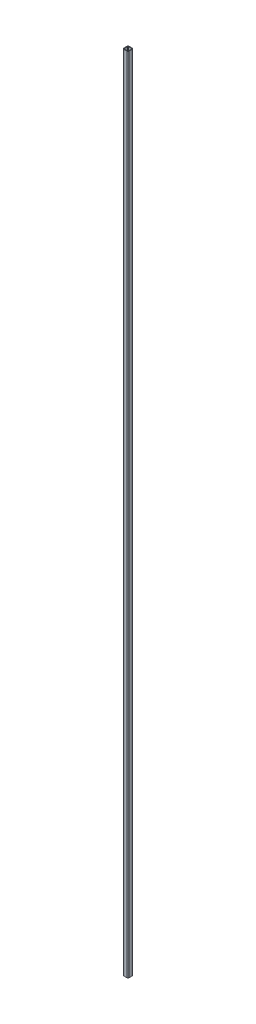
ISO-10303-21;
HEADER;
FILE_DESCRIPTION(('STEP AP214'),'2;1');
FILE_NAME('part.step','',(''),(''),'','','');
FILE_SCHEMA(('AUTOMOTIVE_DESIGN { 1 0 10303 214 1 1 1 1 }'));
ENDSEC;
DATA;
#1=APPLICATION_CONTEXT('core data for automotive mechanical design processes');
#2=APPLICATION_PROTOCOL_DEFINITION('international standard','automotive_design',2000,#1);
#3=PRODUCT_CONTEXT('',#1,'mechanical');
#4=PRODUCT('Part','Part','',(#3));
#5=PRODUCT_RELATED_PRODUCT_CATEGORY('part','',(#4));
#6=PRODUCT_DEFINITION_FORMATION('','',#4);
#7=PRODUCT_DEFINITION_CONTEXT('part definition',#1,'design');
#8=PRODUCT_DEFINITION('design','',#6,#7);
#9=PRODUCT_DEFINITION_SHAPE('','',#8);
#10=(LENGTH_UNIT() NAMED_UNIT(*) SI_UNIT(.MILLI.,.METRE.));
#11=(NAMED_UNIT(*) PLANE_ANGLE_UNIT() SI_UNIT($,.RADIAN.));
#12=(NAMED_UNIT(*) SI_UNIT($,.STERADIAN.) SOLID_ANGLE_UNIT());
#13=UNCERTAINTY_MEASURE_WITH_UNIT(LENGTH_MEASURE(1.E-05),#10,'distance_accuracy_value','');
#14=(GEOMETRIC_REPRESENTATION_CONTEXT(3) GLOBAL_UNCERTAINTY_ASSIGNED_CONTEXT((#13)) GLOBAL_UNIT_ASSIGNED_CONTEXT((#10,
#11,#12)) REPRESENTATION_CONTEXT('',''));
#15=CARTESIAN_POINT('',(0.,0.,0.));
#16=DIRECTION('',(0.,0.,1.));
#17=DIRECTION('',(1.,0.,0.));
#18=AXIS2_PLACEMENT_3D('',#15,#16,#17);
#19=CARTESIAN_POINT('',(-6.,3048.,6.));
#20=DIRECTION('',(0.,-1.,0.));
#21=DIRECTION('',(0.,0.,-1.));
#22=AXIS2_PLACEMENT_3D('',#19,#20,#21);
#23=CYLINDRICAL_SURFACE('',#22,4.);
#24=CARTESIAN_POINT('',(-6.,0.,6.));
#25=DIRECTION('',(0.,1.,0.));
#26=DIRECTION('',(0.,0.,1.));
#27=AXIS2_PLACEMENT_3D('',#24,#25,#26);
#28=CIRCLE('',#27,4.);
#29=CARTESIAN_POINT('',(-10.,0.,6.));
#30=VERTEX_POINT('',#29);
#31=CARTESIAN_POINT('',(-6.,0.,10.));
#32=VERTEX_POINT('',#31);
#33=EDGE_CURVE('E214',#30,#32,#28,.T.);
#34=ORIENTED_EDGE('',*,*,#33,.T.);
#35=DIRECTION('',(0.,-1.,0.));
#36=VECTOR('',#35,1.);
#37=CARTESIAN_POINT('',(-6.,3048.,10.));
#38=LINE('',#37,#36);
#39=CARTESIAN_POINT('',(-6.,3048.,10.));
#40=VERTEX_POINT('',#39);
#41=EDGE_CURVE('E11',#40,#32,#38,.T.);
#42=ORIENTED_EDGE('',*,*,#41,.F.);
#43=CARTESIAN_POINT('',(-6.,3048.,6.));
#44=DIRECTION('',(0.,1.,0.));
#45=DIRECTION('',(0.,0.,1.));
#46=AXIS2_PLACEMENT_3D('',#43,#44,#45);
#47=CIRCLE('',#46,4.);
#48=CARTESIAN_POINT('',(-10.,3048.,6.));
#49=VERTEX_POINT('',#48);
#50=EDGE_CURVE('E292',#49,#40,#47,.T.);
#51=ORIENTED_EDGE('',*,*,#50,.F.);
#52=DIRECTION('',(0.,-1.,0.));
#53=VECTOR('',#52,1.);
#54=CARTESIAN_POINT('',(-10.,3048.,6.));
#55=LINE('',#54,#53);
#56=EDGE_CURVE('E229',#49,#30,#55,.T.);
#57=ORIENTED_EDGE('',*,*,#56,.T.);
#58=EDGE_LOOP('',(#34,#42,#51,#57));
#59=FACE_BOUND('',#58,.T.);
#60=ADVANCED_FACE('F42',(#59),#23,.T.);
#61=CARTESIAN_POINT('',(-6.,3048.,10.));
#62=DIRECTION('',(0.,0.,-1.));
#63=DIRECTION('',(-1.,0.,0.));
#64=AXIS2_PLACEMENT_3D('',#61,#62,#63);
#65=PLANE('',#64);
#66=DIRECTION('',(1.,0.,0.));
#67=VECTOR('',#66,1.);
#68=CARTESIAN_POINT('',(-6.,0.,10.));
#69=LINE('',#68,#67);
#70=CARTESIAN_POINT('',(6.,0.,10.));
#71=VERTEX_POINT('',#70);
#72=EDGE_CURVE('E217',#32,#71,#69,.T.);
#73=ORIENTED_EDGE('',*,*,#72,.T.);
#74=DIRECTION('',(0.,-1.,0.));
#75=VECTOR('',#74,1.);
#76=CARTESIAN_POINT('',(6.,3048.,10.));
#77=LINE('',#76,#75);
#78=CARTESIAN_POINT('',(6.,3048.,10.));
#79=VERTEX_POINT('',#78);
#80=EDGE_CURVE('E52',#79,#71,#77,.T.);
#81=ORIENTED_EDGE('',*,*,#80,.F.);
#82=DIRECTION('',(1.,0.,0.));
#83=VECTOR('',#82,1.);
#84=CARTESIAN_POINT('',(-6.,3048.,10.));
#85=LINE('',#84,#83);
#86=EDGE_CURVE('E294',#40,#79,#85,.T.);
#87=ORIENTED_EDGE('',*,*,#86,.F.);
#88=ORIENTED_EDGE('',*,*,#41,.T.);
#89=EDGE_LOOP('',(#73,#81,#87,#88));
#90=FACE_BOUND('',#89,.T.);
#91=ADVANCED_FACE('F329',(#90),#65,.F.);
#92=CARTESIAN_POINT('',(6.,3048.,6.));
#93=DIRECTION('',(0.,-1.,0.));
#94=DIRECTION('',(0.,0.,-1.));
#95=AXIS2_PLACEMENT_3D('',#92,#93,#94);
#96=CYLINDRICAL_SURFACE('',#95,4.);
#97=CARTESIAN_POINT('',(6.,0.,6.));
#98=DIRECTION('',(0.,1.,0.));
#99=DIRECTION('',(0.,0.,1.));
#100=AXIS2_PLACEMENT_3D('',#97,#98,#99);
#101=CIRCLE('',#100,4.);
#102=CARTESIAN_POINT('',(10.,0.,6.));
#103=VERTEX_POINT('',#102);
#104=EDGE_CURVE('E219',#71,#103,#101,.T.);
#105=ORIENTED_EDGE('',*,*,#104,.T.);
#106=DIRECTION('',(0.,-1.,0.));
#107=VECTOR('',#106,1.);
#108=CARTESIAN_POINT('',(10.,3048.,6.));
#109=LINE('',#108,#107);
#110=CARTESIAN_POINT('',(10.,3048.,6.));
#111=VERTEX_POINT('',#110);
#112=EDGE_CURVE('E236',#111,#103,#109,.T.);
#113=ORIENTED_EDGE('',*,*,#112,.F.);
#114=CARTESIAN_POINT('',(6.,3048.,6.));
#115=DIRECTION('',(0.,1.,0.));
#116=DIRECTION('',(0.,0.,1.));
#117=AXIS2_PLACEMENT_3D('',#114,#115,#116);
#118=CIRCLE('',#117,4.);
#119=EDGE_CURVE('E296',#79,#111,#118,.T.);
#120=ORIENTED_EDGE('',*,*,#119,.F.);
#121=ORIENTED_EDGE('',*,*,#80,.T.);
#122=EDGE_LOOP('',(#105,#113,#120,#121));
#123=FACE_BOUND('',#122,.T.);
#124=ADVANCED_FACE('F334',(#123),#96,.T.);
#125=CARTESIAN_POINT('',(10.,3048.,-6.));
#126=DIRECTION('',(-1.,0.,0.));
#127=DIRECTION('',(0.,0.,1.));
#128=AXIS2_PLACEMENT_3D('',#125,#126,#127);
#129=PLANE('',#128);
#130=DIRECTION('',(0.,0.,-1.));
#131=VECTOR('',#130,1.);
#132=CARTESIAN_POINT('',(10.,0.,-6.));
#133=LINE('',#132,#131);
#134=CARTESIAN_POINT('',(10.,0.,-6.));
#135=VERTEX_POINT('',#134);
#136=EDGE_CURVE('E221',#103,#135,#133,.T.);
#137=ORIENTED_EDGE('',*,*,#136,.T.);
#138=DIRECTION('',(0.,-1.,0.));
#139=VECTOR('',#138,1.);
#140=CARTESIAN_POINT('',(10.,3048.,-6.));
#141=LINE('',#140,#139);
#142=CARTESIAN_POINT('',(10.,3048.,-6.));
#143=VERTEX_POINT('',#142);
#144=EDGE_CURVE('E233',#143,#135,#141,.T.);
#145=ORIENTED_EDGE('',*,*,#144,.F.);
#146=DIRECTION('',(0.,0.,-1.));
#147=VECTOR('',#146,1.);
#148=CARTESIAN_POINT('',(10.,3048.,-6.));
#149=LINE('',#148,#147);
#150=EDGE_CURVE('E298',#111,#143,#149,.T.);
#151=ORIENTED_EDGE('',*,*,#150,.F.);
#152=ORIENTED_EDGE('',*,*,#112,.T.);
#153=EDGE_LOOP('',(#137,#145,#151,#152));
#154=FACE_BOUND('',#153,.T.);
#155=ADVANCED_FACE('F304',(#154),#129,.F.);
#156=CARTESIAN_POINT('',(6.,3048.,-6.));
#157=DIRECTION('',(0.,-1.,0.));
#158=DIRECTION('',(0.,0.,-1.));
#159=AXIS2_PLACEMENT_3D('',#156,#157,#158);
#160=CYLINDRICAL_SURFACE('',#159,4.);
#161=CARTESIAN_POINT('',(6.,0.,-6.));
#162=DIRECTION('',(0.,1.,0.));
#163=DIRECTION('',(0.,0.,1.));
#164=AXIS2_PLACEMENT_3D('',#161,#162,#163);
#165=CIRCLE('',#164,4.);
#166=CARTESIAN_POINT('',(6.,0.,-10.));
#167=VERTEX_POINT('',#166);
#168=EDGE_CURVE('E223',#135,#167,#165,.T.);
#169=ORIENTED_EDGE('',*,*,#168,.T.);
#170=DIRECTION('',(0.,-1.,0.));
#171=VECTOR('',#170,1.);
#172=CARTESIAN_POINT('',(6.,3048.,-10.));
#173=LINE('',#172,#171);
#174=CARTESIAN_POINT('',(6.,3048.,-10.));
#175=VERTEX_POINT('',#174);
#176=EDGE_CURVE('E181',#175,#167,#173,.T.);
#177=ORIENTED_EDGE('',*,*,#176,.F.);
#178=CARTESIAN_POINT('',(6.,3048.,-6.));
#179=DIRECTION('',(0.,1.,0.));
#180=DIRECTION('',(0.,0.,1.));
#181=AXIS2_PLACEMENT_3D('',#178,#179,#180);
#182=CIRCLE('',#181,4.);
#183=EDGE_CURVE('E172',#143,#175,#182,.T.);
#184=ORIENTED_EDGE('',*,*,#183,.F.);
#185=ORIENTED_EDGE('',*,*,#144,.T.);
#186=EDGE_LOOP('',(#169,#177,#184,#185));
#187=FACE_BOUND('',#186,.T.);
#188=ADVANCED_FACE('F308',(#187),#160,.T.);
#189=CARTESIAN_POINT('',(6.,3048.,-10.));
#190=DIRECTION('',(0.,0.,1.));
#191=DIRECTION('',(1.,0.,0.));
#192=AXIS2_PLACEMENT_3D('',#189,#190,#191);
#193=PLANE('',#192);
#194=DIRECTION('',(-1.,0.,0.));
#195=VECTOR('',#194,1.);
#196=CARTESIAN_POINT('',(6.,0.,-10.));
#197=LINE('',#196,#195);
#198=CARTESIAN_POINT('',(-6.,0.,-10.));
#199=VERTEX_POINT('',#198);
#200=EDGE_CURVE('E180',#167,#199,#197,.T.);
#201=ORIENTED_EDGE('',*,*,#200,.T.);
#202=DIRECTION('',(0.,-1.,0.));
#203=VECTOR('',#202,1.);
#204=CARTESIAN_POINT('',(-6.,3048.,-10.));
#205=LINE('',#204,#203);
#206=CARTESIAN_POINT('',(-6.,3048.,-10.));
#207=VERTEX_POINT('',#206);
#208=EDGE_CURVE('E177',#207,#199,#205,.T.);
#209=ORIENTED_EDGE('',*,*,#208,.F.);
#210=DIRECTION('',(-1.,0.,0.));
#211=VECTOR('',#210,1.);
#212=CARTESIAN_POINT('',(6.,3048.,-10.));
#213=LINE('',#212,#211);
#214=EDGE_CURVE('E166',#175,#207,#213,.T.);
#215=ORIENTED_EDGE('',*,*,#214,.F.);
#216=ORIENTED_EDGE('',*,*,#176,.T.);
#217=EDGE_LOOP('',(#201,#209,#215,#216));
#218=FACE_BOUND('',#217,.T.);
#219=ADVANCED_FACE('F178',(#218),#193,.F.);
#220=CARTESIAN_POINT('',(-6.,3048.,-6.));
#221=DIRECTION('',(0.,-1.,0.));
#222=DIRECTION('',(0.,0.,-1.));
#223=AXIS2_PLACEMENT_3D('',#220,#221,#222);
#224=CYLINDRICAL_SURFACE('',#223,4.);
#225=CARTESIAN_POINT('',(-6.,0.,-6.));
#226=DIRECTION('',(0.,1.,0.));
#227=DIRECTION('',(0.,0.,1.));
#228=AXIS2_PLACEMENT_3D('',#225,#226,#227);
#229=CIRCLE('',#228,4.);
#230=CARTESIAN_POINT('',(-10.,0.,-6.));
#231=VERTEX_POINT('',#230);
#232=EDGE_CURVE('E114',#199,#231,#229,.T.);
#233=ORIENTED_EDGE('',*,*,#232,.T.);
#234=DIRECTION('',(0.,-1.,0.));
#235=VECTOR('',#234,1.);
#236=CARTESIAN_POINT('',(-10.,3048.,-6.));
#237=LINE('',#236,#235);
#238=CARTESIAN_POINT('',(-10.,3048.,-6.));
#239=VERTEX_POINT('',#238);
#240=EDGE_CURVE('E182',#239,#231,#237,.T.);
#241=ORIENTED_EDGE('',*,*,#240,.F.);
#242=CARTESIAN_POINT('',(-6.,3048.,-6.));
#243=DIRECTION('',(0.,1.,0.));
#244=DIRECTION('',(0.,0.,1.));
#245=AXIS2_PLACEMENT_3D('',#242,#243,#244);
#246=CIRCLE('',#245,4.);
#247=EDGE_CURVE('E170',#207,#239,#246,.T.);
#248=ORIENTED_EDGE('',*,*,#247,.F.);
#249=ORIENTED_EDGE('',*,*,#208,.T.);
#250=EDGE_LOOP('',(#233,#241,#248,#249));
#251=FACE_BOUND('',#250,.T.);
#252=ADVANCED_FACE('F184',(#251),#224,.T.);
#253=CARTESIAN_POINT('',(6.,3048.,6.));
#254=DIRECTION('',(0.,-1.,0.));
#255=DIRECTION('',(0.,0.,-1.));
#256=AXIS2_PLACEMENT_3D('',#253,#254,#255);
#257=CYLINDRICAL_SURFACE('',#256,2.);
#258=CARTESIAN_POINT('',(6.,0.,6.));
#259=DIRECTION('',(0.,1.,0.));
#260=DIRECTION('',(0.,0.,1.));
#261=AXIS2_PLACEMENT_3D('',#258,#259,#260);
#262=CIRCLE('',#261,2.);
#263=CARTESIAN_POINT('',(6.,0.,8.));
#264=VERTEX_POINT('',#263);
#265=CARTESIAN_POINT('',(8.,0.,6.));
#266=VERTEX_POINT('',#265);
#267=EDGE_CURVE('E190',#264,#266,#262,.T.);
#268=ORIENTED_EDGE('',*,*,#267,.F.);
#269=DIRECTION('',(0.,-1.,0.));
#270=VECTOR('',#269,1.);
#271=CARTESIAN_POINT('',(6.,3048.,8.));
#272=LINE('',#271,#270);
#273=CARTESIAN_POINT('',(6.,3048.,8.));
#274=VERTEX_POINT('',#273);
#275=EDGE_CURVE('E46',#274,#264,#272,.T.);
#276=ORIENTED_EDGE('',*,*,#275,.F.);
#277=CARTESIAN_POINT('',(6.,3048.,6.));
#278=DIRECTION('',(0.,1.,0.));
#279=DIRECTION('',(0.,0.,1.));
#280=AXIS2_PLACEMENT_3D('',#277,#278,#279);
#281=CIRCLE('',#280,2.);
#282=CARTESIAN_POINT('',(8.,3048.,6.));
#283=VERTEX_POINT('',#282);
#284=EDGE_CURVE('E228',#274,#283,#281,.T.);
#285=ORIENTED_EDGE('',*,*,#284,.T.);
#286=DIRECTION('',(0.,-1.,0.));
#287=VECTOR('',#286,1.);
#288=CARTESIAN_POINT('',(8.,3048.,6.));
#289=LINE('',#288,#287);
#290=EDGE_CURVE('E186',#283,#266,#289,.T.);
#291=ORIENTED_EDGE('',*,*,#290,.T.);
#292=EDGE_LOOP('',(#268,#276,#285,#291));
#293=FACE_BOUND('',#292,.T.);
#294=ADVANCED_FACE('F44',(#293),#257,.F.);
#295=CARTESIAN_POINT('',(-6.,3048.,8.));
#296=DIRECTION('',(0.,0.,-1.));
#297=DIRECTION('',(-1.,0.,0.));
#298=AXIS2_PLACEMENT_3D('',#295,#296,#297);
#299=PLANE('',#298);
#300=DIRECTION('',(1.,0.,0.));
#301=VECTOR('',#300,1.);
#302=CARTESIAN_POINT('',(-6.,0.,8.));
#303=LINE('',#302,#301);
#304=CARTESIAN_POINT('',(-6.,0.,8.));
#305=VERTEX_POINT('',#304);
#306=EDGE_CURVE('E193',#305,#264,#303,.T.);
#307=ORIENTED_EDGE('',*,*,#306,.F.);
#308=DIRECTION('',(0.,-1.,0.));
#309=VECTOR('',#308,1.);
#310=CARTESIAN_POINT('',(-6.,3048.,8.));
#311=LINE('',#310,#309);
#312=CARTESIAN_POINT('',(-6.,3048.,8.));
#313=VERTEX_POINT('',#312);
#314=EDGE_CURVE('E251',#313,#305,#311,.T.);
#315=ORIENTED_EDGE('',*,*,#314,.F.);
#316=DIRECTION('',(1.,0.,0.));
#317=VECTOR('',#316,1.);
#318=CARTESIAN_POINT('',(-6.,3048.,8.));
#319=LINE('',#318,#317);
#320=EDGE_CURVE('E260',#313,#274,#319,.T.);
#321=ORIENTED_EDGE('',*,*,#320,.T.);
#322=ORIENTED_EDGE('',*,*,#275,.T.);
#323=EDGE_LOOP('',(#307,#315,#321,#322));
#324=FACE_BOUND('',#323,.T.);
#325=ADVANCED_FACE('F258',(#324),#299,.T.);
#326=CARTESIAN_POINT('',(-6.,3048.,6.));
#327=DIRECTION('',(0.,-1.,0.));
#328=DIRECTION('',(0.,0.,-1.));
#329=AXIS2_PLACEMENT_3D('',#326,#327,#328);
#330=CYLINDRICAL_SURFACE('',#329,2.);
#331=CARTESIAN_POINT('',(-6.,0.,6.));
#332=DIRECTION('',(0.,1.,0.));
#333=DIRECTION('',(0.,0.,1.));
#334=AXIS2_PLACEMENT_3D('',#331,#332,#333);
#335=CIRCLE('',#334,2.);
#336=CARTESIAN_POINT('',(-8.,0.,6.));
#337=VERTEX_POINT('',#336);
#338=EDGE_CURVE('E196',#337,#305,#335,.T.);
#339=ORIENTED_EDGE('',*,*,#338,.F.);
#340=DIRECTION('',(0.,-1.,0.));
#341=VECTOR('',#340,1.);
#342=CARTESIAN_POINT('',(-8.,3048.,6.));
#343=LINE('',#342,#341);
#344=CARTESIAN_POINT('',(-8.,3048.,6.));
#345=VERTEX_POINT('',#344);
#346=EDGE_CURVE('E250',#345,#337,#343,.T.);
#347=ORIENTED_EDGE('',*,*,#346,.F.);
#348=CARTESIAN_POINT('',(-6.,3048.,6.));
#349=DIRECTION('',(0.,1.,0.));
#350=DIRECTION('',(0.,0.,1.));
#351=AXIS2_PLACEMENT_3D('',#348,#349,#350);
#352=CIRCLE('',#351,2.);
#353=EDGE_CURVE('E268',#345,#313,#352,.T.);
#354=ORIENTED_EDGE('',*,*,#353,.T.);
#355=ORIENTED_EDGE('',*,*,#314,.T.);
#356=EDGE_LOOP('',(#339,#347,#354,#355));
#357=FACE_BOUND('',#356,.T.);
#358=ADVANCED_FACE('F266',(#357),#330,.F.);
#359=CARTESIAN_POINT('',(-8.,3048.,6.));
#360=DIRECTION('',(1.,0.,0.));
#361=DIRECTION('',(0.,0.,-1.));
#362=AXIS2_PLACEMENT_3D('',#359,#360,#361);
#363=PLANE('',#362);
#364=DIRECTION('',(0.,0.,1.));
#365=VECTOR('',#364,1.);
#366=CARTESIAN_POINT('',(-8.,0.,6.));
#367=LINE('',#366,#365);
#368=CARTESIAN_POINT('',(-8.,0.,-6.));
#369=VERTEX_POINT('',#368);
#370=EDGE_CURVE('E199',#369,#337,#367,.T.);
#371=ORIENTED_EDGE('',*,*,#370,.F.);
#372=DIRECTION('',(0.,-1.,0.));
#373=VECTOR('',#372,1.);
#374=CARTESIAN_POINT('',(-8.,3048.,-6.));
#375=LINE('',#374,#373);
#376=CARTESIAN_POINT('',(-8.,3048.,-6.));
#377=VERTEX_POINT('',#376);
#378=EDGE_CURVE('E248',#377,#369,#375,.T.);
#379=ORIENTED_EDGE('',*,*,#378,.F.);
#380=DIRECTION('',(0.,0.,1.));
#381=VECTOR('',#380,1.);
#382=CARTESIAN_POINT('',(-8.,3048.,6.));
#383=LINE('',#382,#381);
#384=EDGE_CURVE('E274',#377,#345,#383,.T.);
#385=ORIENTED_EDGE('',*,*,#384,.T.);
#386=ORIENTED_EDGE('',*,*,#346,.T.);
#387=EDGE_LOOP('',(#371,#379,#385,#386));
#388=FACE_BOUND('',#387,.T.);
#389=ADVANCED_FACE('F277',(#388),#363,.T.);
#390=CARTESIAN_POINT('',(-6.,3048.,-6.));
#391=DIRECTION('',(0.,-1.,0.));
#392=DIRECTION('',(0.,0.,-1.));
#393=AXIS2_PLACEMENT_3D('',#390,#391,#392);
#394=CYLINDRICAL_SURFACE('',#393,2.);
#395=CARTESIAN_POINT('',(-6.,0.,-6.));
#396=DIRECTION('',(0.,1.,0.));
#397=DIRECTION('',(0.,0.,1.));
#398=AXIS2_PLACEMENT_3D('',#395,#396,#397);
#399=CIRCLE('',#398,2.);
#400=CARTESIAN_POINT('',(-6.,0.,-8.));
#401=VERTEX_POINT('',#400);
#402=EDGE_CURVE('E202',#401,#369,#399,.T.);
#403=ORIENTED_EDGE('',*,*,#402,.F.);
#404=DIRECTION('',(0.,-1.,0.));
#405=VECTOR('',#404,1.);
#406=CARTESIAN_POINT('',(-6.,3048.,-8.));
#407=LINE('',#406,#405);
#408=CARTESIAN_POINT('',(-6.,3048.,-8.));
#409=VERTEX_POINT('',#408);
#410=EDGE_CURVE('E246',#409,#401,#407,.T.);
#411=ORIENTED_EDGE('',*,*,#410,.F.);
#412=CARTESIAN_POINT('',(-6.,3048.,-6.));
#413=DIRECTION('',(0.,1.,0.));
#414=DIRECTION('',(0.,0.,1.));
#415=AXIS2_PLACEMENT_3D('',#412,#413,#414);
#416=CIRCLE('',#415,2.);
#417=EDGE_CURVE('E278',#409,#377,#416,.T.);
#418=ORIENTED_EDGE('',*,*,#417,.T.);
#419=ORIENTED_EDGE('',*,*,#378,.T.);
#420=EDGE_LOOP('',(#403,#411,#418,#419));
#421=FACE_BOUND('',#420,.T.);
#422=ADVANCED_FACE('F345',(#421),#394,.F.);
#423=CARTESIAN_POINT('',(6.,3048.,-8.));
#424=DIRECTION('',(0.,0.,1.));
#425=DIRECTION('',(1.,0.,0.));
#426=AXIS2_PLACEMENT_3D('',#423,#424,#425);
#427=PLANE('',#426);
#428=DIRECTION('',(-1.,0.,0.));
#429=VECTOR('',#428,1.);
#430=CARTESIAN_POINT('',(6.,0.,-8.));
#431=LINE('',#430,#429);
#432=CARTESIAN_POINT('',(6.,0.,-8.));
#433=VERTEX_POINT('',#432);
#434=EDGE_CURVE('E205',#433,#401,#431,.T.);
#435=ORIENTED_EDGE('',*,*,#434,.F.);
#436=DIRECTION('',(0.,-1.,0.));
#437=VECTOR('',#436,1.);
#438=CARTESIAN_POINT('',(6.,3048.,-8.));
#439=LINE('',#438,#437);
#440=CARTESIAN_POINT('',(6.,3048.,-8.));
#441=VERTEX_POINT('',#440);
#442=EDGE_CURVE('E244',#441,#433,#439,.T.);
#443=ORIENTED_EDGE('',*,*,#442,.F.);
#444=DIRECTION('',(-1.,0.,0.));
#445=VECTOR('',#444,1.);
#446=CARTESIAN_POINT('',(6.,3048.,-8.));
#447=LINE('',#446,#445);
#448=EDGE_CURVE('E280',#441,#409,#447,.T.);
#449=ORIENTED_EDGE('',*,*,#448,.T.);
#450=ORIENTED_EDGE('',*,*,#410,.T.);
#451=EDGE_LOOP('',(#435,#443,#449,#450));
#452=FACE_BOUND('',#451,.T.);
#453=ADVANCED_FACE('F341',(#452),#427,.T.);
#454=CARTESIAN_POINT('',(6.,3048.,-6.));
#455=DIRECTION('',(0.,-1.,0.));
#456=DIRECTION('',(0.,0.,-1.));
#457=AXIS2_PLACEMENT_3D('',#454,#455,#456);
#458=CYLINDRICAL_SURFACE('',#457,2.);
#459=CARTESIAN_POINT('',(6.,0.,-6.));
#460=DIRECTION('',(0.,1.,0.));
#461=DIRECTION('',(0.,0.,1.));
#462=AXIS2_PLACEMENT_3D('',#459,#460,#461);
#463=CIRCLE('',#462,2.);
#464=CARTESIAN_POINT('',(8.,0.,-6.));
#465=VERTEX_POINT('',#464);
#466=EDGE_CURVE('E208',#465,#433,#463,.T.);
#467=ORIENTED_EDGE('',*,*,#466,.F.);
#468=DIRECTION('',(0.,-1.,0.));
#469=VECTOR('',#468,1.);
#470=CARTESIAN_POINT('',(8.,3048.,-6.));
#471=LINE('',#470,#469);
#472=CARTESIAN_POINT('',(8.,3048.,-6.));
#473=VERTEX_POINT('',#472);
#474=EDGE_CURVE('E242',#473,#465,#471,.T.);
#475=ORIENTED_EDGE('',*,*,#474,.F.);
#476=CARTESIAN_POINT('',(6.,3048.,-6.));
#477=DIRECTION('',(0.,1.,0.));
#478=DIRECTION('',(0.,0.,1.));
#479=AXIS2_PLACEMENT_3D('',#476,#477,#478);
#480=CIRCLE('',#479,2.);
#481=EDGE_CURVE('E286',#473,#441,#480,.T.);
#482=ORIENTED_EDGE('',*,*,#481,.T.);
#483=ORIENTED_EDGE('',*,*,#442,.T.);
#484=EDGE_LOOP('',(#467,#475,#482,#483));
#485=FACE_BOUND('',#484,.T.);
#486=ADVANCED_FACE('F323',(#485),#458,.F.);
#487=CARTESIAN_POINT('',(8.,3048.,-6.));
#488=DIRECTION('',(-1.,0.,0.));
#489=DIRECTION('',(0.,0.,1.));
#490=AXIS2_PLACEMENT_3D('',#487,#488,#489);
#491=PLANE('',#490);
#492=DIRECTION('',(0.,0.,-1.));
#493=VECTOR('',#492,1.);
#494=CARTESIAN_POINT('',(8.,0.,-6.));
#495=LINE('',#494,#493);
#496=EDGE_CURVE('E211',#266,#465,#495,.T.);
#497=ORIENTED_EDGE('',*,*,#496,.F.);
#498=ORIENTED_EDGE('',*,*,#290,.F.);
#499=DIRECTION('',(0.,0.,-1.));
#500=VECTOR('',#499,1.);
#501=CARTESIAN_POINT('',(8.,3048.,-6.));
#502=LINE('',#501,#500);
#503=EDGE_CURVE('E289',#283,#473,#502,.T.);
#504=ORIENTED_EDGE('',*,*,#503,.T.);
#505=ORIENTED_EDGE('',*,*,#474,.T.);
#506=EDGE_LOOP('',(#497,#498,#504,#505));
#507=FACE_BOUND('',#506,.T.);
#508=ADVANCED_FACE('F316',(#507),#491,.T.);
#509=CARTESIAN_POINT('',(-10.,3048.,6.));
#510=DIRECTION('',(1.,0.,0.));
#511=DIRECTION('',(0.,0.,-1.));
#512=AXIS2_PLACEMENT_3D('',#509,#510,#511);
#513=PLANE('',#512);
#514=DIRECTION('',(0.,0.,1.));
#515=VECTOR('',#514,1.);
#516=CARTESIAN_POINT('',(-10.,0.,6.));
#517=LINE('',#516,#515);
#518=EDGE_CURVE('E120',#231,#30,#517,.T.);
#519=ORIENTED_EDGE('',*,*,#518,.T.);
#520=ORIENTED_EDGE('',*,*,#56,.F.);
#521=DIRECTION('',(0.,0.,1.));
#522=VECTOR('',#521,1.);
#523=CARTESIAN_POINT('',(-10.,3048.,6.));
#524=LINE('',#523,#522);
#525=EDGE_CURVE('E61',#239,#49,#524,.T.);
#526=ORIENTED_EDGE('',*,*,#525,.F.);
#527=ORIENTED_EDGE('',*,*,#240,.T.);
#528=EDGE_LOOP('',(#519,#520,#526,#527));
#529=FACE_BOUND('',#528,.T.);
#530=ADVANCED_FACE('F314',(#529),#513,.F.);
#531=CARTESIAN_POINT('',(-6.,3048.,6.));
#532=DIRECTION('',(0.,1.,0.));
#533=DIRECTION('',(0.,0.,1.));
#534=AXIS2_PLACEMENT_3D('',#531,#532,#533);
#535=PLANE('',#534);
#536=ORIENTED_EDGE('',*,*,#284,.F.);
#537=ORIENTED_EDGE('',*,*,#320,.F.);
#538=ORIENTED_EDGE('',*,*,#353,.F.);
#539=ORIENTED_EDGE('',*,*,#384,.F.);
#540=ORIENTED_EDGE('',*,*,#417,.F.);
#541=ORIENTED_EDGE('',*,*,#448,.F.);
#542=ORIENTED_EDGE('',*,*,#481,.F.);
#543=ORIENTED_EDGE('',*,*,#503,.F.);
#544=EDGE_LOOP('',(#536,#537,#538,#539,#540,#541,#542,#543));
#545=FACE_BOUND('',#544,.T.);
#546=ORIENTED_EDGE('',*,*,#50,.T.);
#547=ORIENTED_EDGE('',*,*,#86,.T.);
#548=ORIENTED_EDGE('',*,*,#119,.T.);
#549=ORIENTED_EDGE('',*,*,#150,.T.);
#550=ORIENTED_EDGE('',*,*,#183,.T.);
#551=ORIENTED_EDGE('',*,*,#214,.T.);
#552=ORIENTED_EDGE('',*,*,#247,.T.);
#553=ORIENTED_EDGE('',*,*,#525,.T.);
#554=EDGE_LOOP('',(#546,#547,#548,#549,#550,#551,#552,#553));
#555=FACE_BOUND('',#554,.T.);
#556=ADVANCED_FACE('F168',(#545,#555),#535,.T.);
#557=CARTESIAN_POINT('',(-6.,0.,6.));
#558=DIRECTION('',(0.,1.,0.));
#559=DIRECTION('',(0.,0.,1.));
#560=AXIS2_PLACEMENT_3D('',#557,#558,#559);
#561=PLANE('',#560);
#562=ORIENTED_EDGE('',*,*,#267,.T.);
#563=ORIENTED_EDGE('',*,*,#496,.T.);
#564=ORIENTED_EDGE('',*,*,#466,.T.);
#565=ORIENTED_EDGE('',*,*,#434,.T.);
#566=ORIENTED_EDGE('',*,*,#402,.T.);
#567=ORIENTED_EDGE('',*,*,#370,.T.);
#568=ORIENTED_EDGE('',*,*,#338,.T.);
#569=ORIENTED_EDGE('',*,*,#306,.T.);
#570=EDGE_LOOP('',(#562,#563,#564,#565,#566,#567,#568,#569));
#571=FACE_BOUND('',#570,.T.);
#572=ORIENTED_EDGE('',*,*,#33,.F.);
#573=ORIENTED_EDGE('',*,*,#518,.F.);
#574=ORIENTED_EDGE('',*,*,#232,.F.);
#575=ORIENTED_EDGE('',*,*,#200,.F.);
#576=ORIENTED_EDGE('',*,*,#168,.F.);
#577=ORIENTED_EDGE('',*,*,#136,.F.);
#578=ORIENTED_EDGE('',*,*,#104,.F.);
#579=ORIENTED_EDGE('',*,*,#72,.F.);
#580=EDGE_LOOP('',(#572,#573,#574,#575,#576,#577,#578,#579));
#581=FACE_BOUND('',#580,.T.);
#582=ADVANCED_FACE('F263',(#571,#581),#561,.F.);
#583=CLOSED_SHELL('',(#60,#91,#124,#155,#188,#219,#252,#294,#325,#358,#389,#422,#453,#486,#508,
#530,#556,#582));
#584=MANIFOLD_SOLID_BREP('B2',#583);
#585=ADVANCED_BREP_SHAPE_REPRESENTATION('',(#18,#584),#14);
#586=SHAPE_DEFINITION_REPRESENTATION(#9,#585);
ENDSEC;
END-ISO-10303-21;
